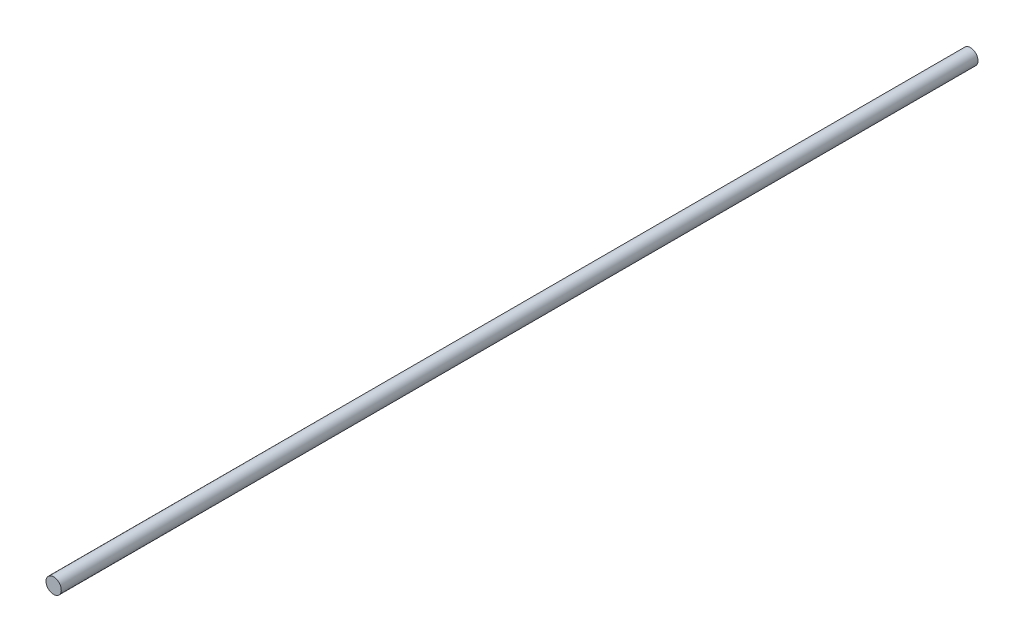
ISO-10303-21;
HEADER;
FILE_DESCRIPTION(('STEP AP214'),'2;1');
FILE_NAME('part.step','',(''),(''),'','','');
FILE_SCHEMA(('AUTOMOTIVE_DESIGN { 1 0 10303 214 1 1 1 1 }'));
ENDSEC;
DATA;
#1=APPLICATION_CONTEXT('core data for automotive mechanical design processes');
#2=APPLICATION_PROTOCOL_DEFINITION('international standard','automotive_design',2000,#1);
#3=PRODUCT_CONTEXT('',#1,'mechanical');
#4=PRODUCT('Part','Part','',(#3));
#5=PRODUCT_RELATED_PRODUCT_CATEGORY('part','',(#4));
#6=PRODUCT_DEFINITION_FORMATION('','',#4);
#7=PRODUCT_DEFINITION_CONTEXT('part definition',#1,'design');
#8=PRODUCT_DEFINITION('design','',#6,#7);
#9=PRODUCT_DEFINITION_SHAPE('','',#8);
#10=(LENGTH_UNIT() NAMED_UNIT(*) SI_UNIT(.MILLI.,.METRE.));
#11=(NAMED_UNIT(*) PLANE_ANGLE_UNIT() SI_UNIT($,.RADIAN.));
#12=(NAMED_UNIT(*) SI_UNIT($,.STERADIAN.) SOLID_ANGLE_UNIT());
#13=UNCERTAINTY_MEASURE_WITH_UNIT(LENGTH_MEASURE(1.E-05),#10,'distance_accuracy_value','');
#14=(GEOMETRIC_REPRESENTATION_CONTEXT(3) GLOBAL_UNCERTAINTY_ASSIGNED_CONTEXT((#13)) GLOBAL_UNIT_ASSIGNED_CONTEXT((#10,
#11,#12)) REPRESENTATION_CONTEXT('',''));
#15=CARTESIAN_POINT('',(0.,0.,0.));
#16=DIRECTION('',(0.,0.,1.));
#17=DIRECTION('',(1.,0.,0.));
#18=AXIS2_PLACEMENT_3D('',#15,#16,#17);
#19=CARTESIAN_POINT('',(0.,0.,381.));
#20=DIRECTION('',(0.,0.,-1.));
#21=DIRECTION('',(-1.,0.,0.));
#22=AXIS2_PLACEMENT_3D('',#19,#20,#21);
#23=CYLINDRICAL_SURFACE('',#22,6.35);
#24=CARTESIAN_POINT('',(0.,0.,381.));
#25=DIRECTION('',(0.,0.,1.));
#26=DIRECTION('',(1.,0.,0.));
#27=AXIS2_PLACEMENT_3D('',#24,#25,#26);
#28=CIRCLE('',#27,6.35);
#29=CARTESIAN_POINT('',(6.35,0.,381.));
#30=VERTEX_POINT('',#29);
#31=EDGE_CURVE('E10',#30,#30,#28,.T.);
#32=ORIENTED_EDGE('',*,*,#31,.F.);
#33=EDGE_LOOP('',(#32));
#34=FACE_BOUND('',#33,.T.);
#35=CARTESIAN_POINT('',(0.,0.,-381.));
#36=DIRECTION('',(0.,0.,1.));
#37=DIRECTION('',(1.,0.,0.));
#38=AXIS2_PLACEMENT_3D('',#35,#36,#37);
#39=CIRCLE('',#38,6.35);
#40=CARTESIAN_POINT('',(6.35,0.,-381.));
#41=VERTEX_POINT('',#40);
#42=EDGE_CURVE('E33',#41,#41,#39,.T.);
#43=ORIENTED_EDGE('',*,*,#42,.T.);
#44=EDGE_LOOP('',(#43));
#45=FACE_BOUND('',#44,.T.);
#46=ADVANCED_FACE('F30',(#34,#45),#23,.T.);
#47=CARTESIAN_POINT('',(0.,0.,381.));
#48=DIRECTION('',(0.,0.,1.));
#49=DIRECTION('',(1.,0.,0.));
#50=AXIS2_PLACEMENT_3D('',#47,#48,#49);
#51=PLANE('',#50);
#52=ORIENTED_EDGE('',*,*,#31,.T.);
#53=EDGE_LOOP('',(#52));
#54=FACE_BOUND('',#53,.T.);
#55=ADVANCED_FACE('F45',(#54),#51,.T.);
#56=CARTESIAN_POINT('',(0.,0.,-381.));
#57=DIRECTION('',(0.,0.,1.));
#58=DIRECTION('',(1.,0.,0.));
#59=AXIS2_PLACEMENT_3D('',#56,#57,#58);
#60=PLANE('',#59);
#61=ORIENTED_EDGE('',*,*,#42,.F.);
#62=EDGE_LOOP('',(#61));
#63=FACE_BOUND('',#62,.T.);
#64=ADVANCED_FACE('F43',(#63),#60,.F.);
#65=CLOSED_SHELL('',(#46,#55,#64));
#66=MANIFOLD_SOLID_BREP('B2',#65);
#67=ADVANCED_BREP_SHAPE_REPRESENTATION('',(#18,#66),#14);
#68=SHAPE_DEFINITION_REPRESENTATION(#9,#67);
ENDSEC;
END-ISO-10303-21;
